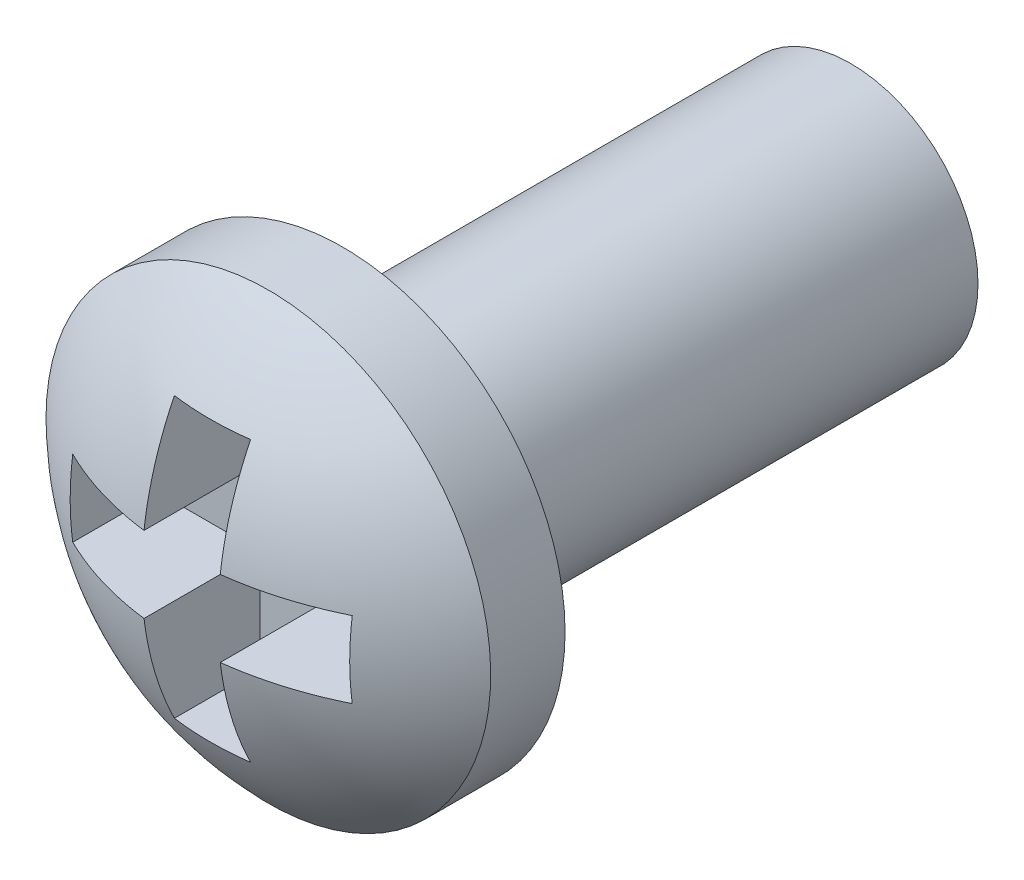
ISO-10303-21;
HEADER;
FILE_DESCRIPTION(('STEP AP214'),'2;1');
FILE_NAME('part.step','',(''),(''),'','','');
FILE_SCHEMA(('AUTOMOTIVE_DESIGN { 1 0 10303 214 1 1 1 1 }'));
ENDSEC;
DATA;
#1=APPLICATION_CONTEXT('core data for automotive mechanical design processes');
#2=APPLICATION_PROTOCOL_DEFINITION('international standard','automotive_design',2000,#1);
#3=PRODUCT_CONTEXT('',#1,'mechanical');
#4=PRODUCT('Part','Part','',(#3));
#5=PRODUCT_RELATED_PRODUCT_CATEGORY('part','',(#4));
#6=PRODUCT_DEFINITION_FORMATION('','',#4);
#7=PRODUCT_DEFINITION_CONTEXT('part definition',#1,'design');
#8=PRODUCT_DEFINITION('design','',#6,#7);
#9=PRODUCT_DEFINITION_SHAPE('','',#8);
#10=(LENGTH_UNIT() NAMED_UNIT(*) SI_UNIT(.MILLI.,.METRE.));
#11=(NAMED_UNIT(*) PLANE_ANGLE_UNIT() SI_UNIT($,.RADIAN.));
#12=(NAMED_UNIT(*) SI_UNIT($,.STERADIAN.) SOLID_ANGLE_UNIT());
#13=UNCERTAINTY_MEASURE_WITH_UNIT(LENGTH_MEASURE(1.E-05),#10,'distance_accuracy_value','');
#14=(GEOMETRIC_REPRESENTATION_CONTEXT(3) GLOBAL_UNCERTAINTY_ASSIGNED_CONTEXT((#13)) GLOBAL_UNIT_ASSIGNED_CONTEXT((#10,
#11,#12)) REPRESENTATION_CONTEXT('',''));
#15=CARTESIAN_POINT('',(0.,0.,0.));
#16=DIRECTION('',(0.,0.,1.));
#17=DIRECTION('',(1.,0.,0.));
#18=AXIS2_PLACEMENT_3D('',#15,#16,#17);
#19=CARTESIAN_POINT('',(0.,0.,-4.));
#20=DIRECTION('',(0.,0.,1.));
#21=DIRECTION('',(1.,0.,0.));
#22=AXIS2_PLACEMENT_3D('',#19,#20,#21);
#23=CYLINDRICAL_SURFACE('',#22,1.);
#24=CARTESIAN_POINT('',(0.,0.,-4.));
#25=DIRECTION('',(0.,0.,1.));
#26=DIRECTION('',(1.,0.,0.));
#27=AXIS2_PLACEMENT_3D('',#24,#25,#26);
#28=CIRCLE('',#27,1.);
#29=CARTESIAN_POINT('',(1.,0.,-4.));
#30=VERTEX_POINT('',#29);
#31=EDGE_CURVE('E212',#30,#30,#28,.T.);
#32=ORIENTED_EDGE('',*,*,#31,.T.);
#33=EDGE_LOOP('',(#32));
#34=FACE_BOUND('',#33,.T.);
#35=CARTESIAN_POINT('',(0.,0.,0.));
#36=DIRECTION('',(0.,0.,1.));
#37=DIRECTION('',(1.,0.,0.));
#38=AXIS2_PLACEMENT_3D('',#35,#36,#37);
#39=CIRCLE('',#38,1.);
#40=CARTESIAN_POINT('',(1.,0.,0.));
#41=VERTEX_POINT('',#40);
#42=EDGE_CURVE('E208',#41,#41,#39,.T.);
#43=ORIENTED_EDGE('',*,*,#42,.F.);
#44=EDGE_LOOP('',(#43));
#45=FACE_BOUND('',#44,.T.);
#46=ADVANCED_FACE('F41',(#34,#45),#23,.T.);
#47=CARTESIAN_POINT('',(0.,0.,-4.));
#48=DIRECTION('',(0.,0.,1.));
#49=DIRECTION('',(1.,0.,0.));
#50=AXIS2_PLACEMENT_3D('',#47,#48,#49);
#51=PLANE('',#50);
#52=ORIENTED_EDGE('',*,*,#31,.F.);
#53=EDGE_LOOP('',(#52));
#54=FACE_BOUND('',#53,.T.);
#55=ADVANCED_FACE('F281',(#54),#51,.F.);
#56=CARTESIAN_POINT('',(0.,0.,0.));
#57=DIRECTION('',(0.,0.,1.));
#58=DIRECTION('',(1.,0.,0.));
#59=AXIS2_PLACEMENT_3D('',#56,#57,#58);
#60=PLANE('',#59);
#61=ORIENTED_EDGE('',*,*,#42,.T.);
#62=EDGE_LOOP('',(#61));
#63=FACE_BOUND('',#62,.T.);
#64=CARTESIAN_POINT('',(0.,0.,0.));
#65=DIRECTION('',(0.,0.,-1.));
#66=DIRECTION('',(-1.,0.,0.));
#67=AXIS2_PLACEMENT_3D('',#64,#65,#66);
#68=CIRCLE('',#67,1.75);
#69=CARTESIAN_POINT('',(-1.75,0.,0.));
#70=VERTEX_POINT('',#69);
#71=EDGE_CURVE('E210',#70,#70,#68,.T.);
#72=ORIENTED_EDGE('',*,*,#71,.T.);
#73=EDGE_LOOP('',(#72));
#74=FACE_BOUND('',#73,.T.);
#75=ADVANCED_FACE('F286',(#63,#74),#60,.F.);
#76=CARTESIAN_POINT('',(0.,0.,-2.));
#77=DIRECTION('',(0.,0.,-1.));
#78=DIRECTION('',(-1.,0.,0.));
#79=AXIS2_PLACEMENT_3D('',#76,#77,#78);
#80=CYLINDRICAL_SURFACE('',#79,1.75);
#81=ORIENTED_EDGE('',*,*,#71,.F.);
#82=EDGE_LOOP('',(#81));
#83=FACE_BOUND('',#82,.T.);
#84=CARTESIAN_POINT('',(0.,0.,0.585357107135713));
#85=DIRECTION('',(0.,0.,-1.));
#86=DIRECTION('',(-1.,0.,0.));
#87=AXIS2_PLACEMENT_3D('',#84,#85,#86);
#88=CIRCLE('',#87,1.75);
#89=CARTESIAN_POINT('',(-1.75,0.,0.585357107135713));
#90=VERTEX_POINT('',#89);
#91=EDGE_CURVE('E180',#90,#90,#88,.T.);
#92=ORIENTED_EDGE('',*,*,#91,.T.);
#93=EDGE_LOOP('',(#92));
#94=FACE_BOUND('',#93,.T.);
#95=ADVANCED_FACE('F300',(#83,#94),#80,.T.);
#96=CARTESIAN_POINT('',(0.,0.,-1.2));
#97=DIRECTION('',(0.,0.,-1.));
#98=DIRECTION('',(1.,0.,0.));
#99=AXIS2_PLACEMENT_3D('',#96,#97,#98);
#100=SPHERICAL_SURFACE('',#99,2.5);
#101=CARTESIAN_POINT('',(0.,-1.1,-1.2));
#102=DIRECTION('',(0.,-1.,0.));
#103=DIRECTION('',(0.,0.,-1.));
#104=AXIS2_PLACEMENT_3D('',#101,#102,#103);
#105=CIRCLE('',#104,2.24499443206437);
#106=CARTESIAN_POINT('',(0.3,-1.1,1.0248595461287));
#107=VERTEX_POINT('',#106);
#108=CARTESIAN_POINT('',(-0.3,-1.1,1.0248595461287));
#109=VERTEX_POINT('',#108);
#110=EDGE_CURVE('E211',#107,#109,#105,.T.);
#111=ORIENTED_EDGE('',*,*,#110,.T.);
#112=CARTESIAN_POINT('',(-0.3,0.,-1.2));
#113=DIRECTION('',(-1.,0.,0.));
#114=DIRECTION('',(0.,0.,1.));
#115=AXIS2_PLACEMENT_3D('',#112,#113,#114);
#116=CIRCLE('',#115,2.48193472919818);
#117=CARTESIAN_POINT('',(-0.3,-0.3,1.26373699895098));
#118=VERTEX_POINT('',#117);
#119=EDGE_CURVE('E11',#109,#118,#116,.T.);
#120=ORIENTED_EDGE('',*,*,#119,.T.);
#121=CARTESIAN_POINT('',(0.,-0.3,-1.2));
#122=DIRECTION('',(0.,-1.,0.));
#123=DIRECTION('',(0.,0.,-1.));
#124=AXIS2_PLACEMENT_3D('',#121,#122,#123);
#125=CIRCLE('',#124,2.48193472919818);
#126=CARTESIAN_POINT('',(-1.1,-0.3,1.0248595461287));
#127=VERTEX_POINT('',#126);
#128=EDGE_CURVE('E48',#118,#127,#125,.T.);
#129=ORIENTED_EDGE('',*,*,#128,.T.);
#130=CARTESIAN_POINT('',(-1.1,0.,-1.2));
#131=DIRECTION('',(-1.,0.,0.));
#132=DIRECTION('',(0.,0.,1.));
#133=AXIS2_PLACEMENT_3D('',#130,#131,#132);
#134=CIRCLE('',#133,2.24499443206437);
#135=CARTESIAN_POINT('',(-1.1,0.3,1.0248595461287));
#136=VERTEX_POINT('',#135);
#137=EDGE_CURVE('E245',#127,#136,#134,.T.);
#138=ORIENTED_EDGE('',*,*,#137,.T.);
#139=CARTESIAN_POINT('',(0.,0.3,-1.2));
#140=DIRECTION('',(0.,1.,0.));
#141=DIRECTION('',(0.,0.,1.));
#142=AXIS2_PLACEMENT_3D('',#139,#140,#141);
#143=CIRCLE('',#142,2.48193472919818);
#144=CARTESIAN_POINT('',(-0.3,0.3,1.26373699895098));
#145=VERTEX_POINT('',#144);
#146=EDGE_CURVE('E236',#136,#145,#143,.T.);
#147=ORIENTED_EDGE('',*,*,#146,.T.);
#148=CARTESIAN_POINT('',(-0.3,0.,-1.2));
#149=DIRECTION('',(-1.,0.,0.));
#150=DIRECTION('',(0.,0.,1.));
#151=AXIS2_PLACEMENT_3D('',#148,#149,#150);
#152=CIRCLE('',#151,2.48193472919818);
#153=CARTESIAN_POINT('',(-0.3,1.1,1.0248595461287));
#154=VERTEX_POINT('',#153);
#155=EDGE_CURVE('E237',#145,#154,#152,.T.);
#156=ORIENTED_EDGE('',*,*,#155,.T.);
#157=CARTESIAN_POINT('',(0.,1.1,-1.2));
#158=DIRECTION('',(0.,1.,0.));
#159=DIRECTION('',(0.,0.,1.));
#160=AXIS2_PLACEMENT_3D('',#157,#158,#159);
#161=CIRCLE('',#160,2.24499443206437);
#162=CARTESIAN_POINT('',(0.3,1.1,1.0248595461287));
#163=VERTEX_POINT('',#162);
#164=EDGE_CURVE('E231',#154,#163,#161,.T.);
#165=ORIENTED_EDGE('',*,*,#164,.T.);
#166=CARTESIAN_POINT('',(0.3,0.,-1.2));
#167=DIRECTION('',(1.,0.,0.));
#168=DIRECTION('',(0.,0.,-1.));
#169=AXIS2_PLACEMENT_3D('',#166,#167,#168);
#170=CIRCLE('',#169,2.48193472919818);
#171=CARTESIAN_POINT('',(0.3,0.3,1.26373699895098));
#172=VERTEX_POINT('',#171);
#173=EDGE_CURVE('E229',#163,#172,#170,.T.);
#174=ORIENTED_EDGE('',*,*,#173,.T.);
#175=CARTESIAN_POINT('',(0.,0.3,-1.2));
#176=DIRECTION('',(0.,1.,0.));
#177=DIRECTION('',(0.,0.,1.));
#178=AXIS2_PLACEMENT_3D('',#175,#176,#177);
#179=CIRCLE('',#178,2.48193472919818);
#180=CARTESIAN_POINT('',(1.1,0.3,1.0248595461287));
#181=VERTEX_POINT('',#180);
#182=EDGE_CURVE('E230',#172,#181,#179,.T.);
#183=ORIENTED_EDGE('',*,*,#182,.T.);
#184=CARTESIAN_POINT('',(1.1,0.,-1.2));
#185=DIRECTION('',(1.,0.,0.));
#186=DIRECTION('',(0.,0.,-1.));
#187=AXIS2_PLACEMENT_3D('',#184,#185,#186);
#188=CIRCLE('',#187,2.24499443206437);
#189=CARTESIAN_POINT('',(1.1,-0.3,1.0248595461287));
#190=VERTEX_POINT('',#189);
#191=EDGE_CURVE('E224',#181,#190,#188,.T.);
#192=ORIENTED_EDGE('',*,*,#191,.T.);
#193=CARTESIAN_POINT('',(0.,-0.3,-1.2));
#194=DIRECTION('',(0.,-1.,0.));
#195=DIRECTION('',(0.,0.,-1.));
#196=AXIS2_PLACEMENT_3D('',#193,#194,#195);
#197=CIRCLE('',#196,2.48193472919818);
#198=CARTESIAN_POINT('',(0.3,-0.3,1.26373699895098));
#199=VERTEX_POINT('',#198);
#200=EDGE_CURVE('E222',#190,#199,#197,.T.);
#201=ORIENTED_EDGE('',*,*,#200,.T.);
#202=CARTESIAN_POINT('',(0.3,0.,-1.2));
#203=DIRECTION('',(1.,0.,0.));
#204=DIRECTION('',(0.,0.,-1.));
#205=AXIS2_PLACEMENT_3D('',#202,#203,#204);
#206=CIRCLE('',#205,2.48193472919818);
#207=EDGE_CURVE('E217',#199,#107,#206,.T.);
#208=ORIENTED_EDGE('',*,*,#207,.T.);
#209=EDGE_LOOP('',(#111,#120,#129,#138,#147,#156,#165,#174,#183,#192,#201,#208));
#210=FACE_BOUND('',#209,.T.);
#211=ORIENTED_EDGE('',*,*,#91,.F.);
#212=EDGE_LOOP('',(#211));
#213=FACE_BOUND('',#212,.T.);
#214=ADVANCED_FACE('F244',(#210,#213),#100,.T.);
#215=CARTESIAN_POINT('',(-0.3,-0.3,0.35));
#216=DIRECTION('',(-1.,0.,0.));
#217=DIRECTION('',(0.,0.,1.));
#218=AXIS2_PLACEMENT_3D('',#215,#216,#217);
#219=PLANE('',#218);
#220=DIRECTION('',(0.,0.,1.));
#221=VECTOR('',#220,1.);
#222=CARTESIAN_POINT('',(-0.3,-1.1,0.35));
#223=LINE('',#222,#221);
#224=CARTESIAN_POINT('',(-0.3,-1.1,0.35));
#225=VERTEX_POINT('',#224);
#226=EDGE_CURVE('E54',#225,#109,#223,.T.);
#227=ORIENTED_EDGE('',*,*,#226,.F.);
#228=DIRECTION('',(0.,-1.,0.));
#229=VECTOR('',#228,1.);
#230=CARTESIAN_POINT('',(-0.3,-0.3,0.35));
#231=LINE('',#230,#229);
#232=CARTESIAN_POINT('',(-0.3,-0.3,0.35));
#233=VERTEX_POINT('',#232);
#234=EDGE_CURVE('E129',#233,#225,#231,.T.);
#235=ORIENTED_EDGE('',*,*,#234,.F.);
#236=DIRECTION('',(0.,0.,1.));
#237=VECTOR('',#236,1.);
#238=CARTESIAN_POINT('',(-0.3,-0.3,0.35));
#239=LINE('',#238,#237);
#240=EDGE_CURVE('E171',#233,#118,#239,.T.);
#241=ORIENTED_EDGE('',*,*,#240,.T.);
#242=ORIENTED_EDGE('',*,*,#119,.F.);
#243=EDGE_LOOP('',(#227,#235,#241,#242));
#244=FACE_BOUND('',#243,.T.);
#245=ADVANCED_FACE('F127',(#244),#219,.F.);
#246=CARTESIAN_POINT('',(-1.1,-0.3,0.35));
#247=DIRECTION('',(0.,-1.,0.));
#248=DIRECTION('',(0.,0.,-1.));
#249=AXIS2_PLACEMENT_3D('',#246,#247,#248);
#250=PLANE('',#249);
#251=ORIENTED_EDGE('',*,*,#240,.F.);
#252=DIRECTION('',(1.,0.,0.));
#253=VECTOR('',#252,1.);
#254=CARTESIAN_POINT('',(-1.1,-0.3,0.35));
#255=LINE('',#254,#253);
#256=CARTESIAN_POINT('',(-1.1,-0.3,0.35));
#257=VERTEX_POINT('',#256);
#258=EDGE_CURVE('E131',#257,#233,#255,.T.);
#259=ORIENTED_EDGE('',*,*,#258,.F.);
#260=DIRECTION('',(0.,0.,1.));
#261=VECTOR('',#260,1.);
#262=CARTESIAN_POINT('',(-1.1,-0.3,0.35));
#263=LINE('',#262,#261);
#264=EDGE_CURVE('E177',#257,#127,#263,.T.);
#265=ORIENTED_EDGE('',*,*,#264,.T.);
#266=ORIENTED_EDGE('',*,*,#128,.F.);
#267=EDGE_LOOP('',(#251,#259,#265,#266));
#268=FACE_BOUND('',#267,.T.);
#269=ADVANCED_FACE('F273',(#268),#250,.F.);
#270=CARTESIAN_POINT('',(-1.1,0.3,0.35));
#271=DIRECTION('',(-1.,0.,0.));
#272=DIRECTION('',(0.,0.,1.));
#273=AXIS2_PLACEMENT_3D('',#270,#271,#272);
#274=PLANE('',#273);
#275=ORIENTED_EDGE('',*,*,#264,.F.);
#276=DIRECTION('',(0.,-1.,0.));
#277=VECTOR('',#276,1.);
#278=CARTESIAN_POINT('',(-1.1,0.3,0.35));
#279=LINE('',#278,#277);
#280=CARTESIAN_POINT('',(-1.1,0.3,0.35));
#281=VERTEX_POINT('',#280);
#282=EDGE_CURVE('E175',#281,#257,#279,.T.);
#283=ORIENTED_EDGE('',*,*,#282,.F.);
#284=DIRECTION('',(0.,0.,1.));
#285=VECTOR('',#284,1.);
#286=CARTESIAN_POINT('',(-1.1,0.3,0.35));
#287=LINE('',#286,#285);
#288=EDGE_CURVE('E179',#281,#136,#287,.T.);
#289=ORIENTED_EDGE('',*,*,#288,.T.);
#290=ORIENTED_EDGE('',*,*,#137,.F.);
#291=EDGE_LOOP('',(#275,#283,#289,#290));
#292=FACE_BOUND('',#291,.T.);
#293=ADVANCED_FACE('F275',(#292),#274,.F.);
#294=CARTESIAN_POINT('',(-0.3,0.3,0.35));
#295=DIRECTION('',(0.,1.,0.));
#296=DIRECTION('',(0.,0.,1.));
#297=AXIS2_PLACEMENT_3D('',#294,#295,#296);
#298=PLANE('',#297);
#299=ORIENTED_EDGE('',*,*,#288,.F.);
#300=DIRECTION('',(-1.,0.,0.));
#301=VECTOR('',#300,1.);
#302=CARTESIAN_POINT('',(-0.3,0.3,0.35));
#303=LINE('',#302,#301);
#304=CARTESIAN_POINT('',(-0.3,0.3,0.35));
#305=VERTEX_POINT('',#304);
#306=EDGE_CURVE('E168',#305,#281,#303,.T.);
#307=ORIENTED_EDGE('',*,*,#306,.F.);
#308=DIRECTION('',(0.,0.,1.));
#309=VECTOR('',#308,1.);
#310=CARTESIAN_POINT('',(-0.3,0.3,0.35));
#311=LINE('',#310,#309);
#312=EDGE_CURVE('E181',#305,#145,#311,.T.);
#313=ORIENTED_EDGE('',*,*,#312,.T.);
#314=ORIENTED_EDGE('',*,*,#146,.F.);
#315=EDGE_LOOP('',(#299,#307,#313,#314));
#316=FACE_BOUND('',#315,.T.);
#317=ADVANCED_FACE('F269',(#316),#298,.F.);
#318=CARTESIAN_POINT('',(-0.3,1.1,0.35));
#319=DIRECTION('',(-1.,0.,0.));
#320=DIRECTION('',(0.,0.,1.));
#321=AXIS2_PLACEMENT_3D('',#318,#319,#320);
#322=PLANE('',#321);
#323=ORIENTED_EDGE('',*,*,#312,.F.);
#324=DIRECTION('',(0.,-1.,0.));
#325=VECTOR('',#324,1.);
#326=CARTESIAN_POINT('',(-0.3,1.1,0.35));
#327=LINE('',#326,#325);
#328=CARTESIAN_POINT('',(-0.3,1.1,0.35));
#329=VERTEX_POINT('',#328);
#330=EDGE_CURVE('E166',#329,#305,#327,.T.);
#331=ORIENTED_EDGE('',*,*,#330,.F.);
#332=DIRECTION('',(0.,0.,1.));
#333=VECTOR('',#332,1.);
#334=CARTESIAN_POINT('',(-0.3,1.1,0.35));
#335=LINE('',#334,#333);
#336=EDGE_CURVE('E188',#329,#154,#335,.T.);
#337=ORIENTED_EDGE('',*,*,#336,.T.);
#338=ORIENTED_EDGE('',*,*,#155,.F.);
#339=EDGE_LOOP('',(#323,#331,#337,#338));
#340=FACE_BOUND('',#339,.T.);
#341=ADVANCED_FACE('F266',(#340),#322,.F.);
#342=CARTESIAN_POINT('',(0.3,1.1,0.35));
#343=DIRECTION('',(0.,1.,0.));
#344=DIRECTION('',(0.,0.,1.));
#345=AXIS2_PLACEMENT_3D('',#342,#343,#344);
#346=PLANE('',#345);
#347=ORIENTED_EDGE('',*,*,#336,.F.);
#348=DIRECTION('',(-1.,0.,0.));
#349=VECTOR('',#348,1.);
#350=CARTESIAN_POINT('',(0.3,1.1,0.35));
#351=LINE('',#350,#349);
#352=CARTESIAN_POINT('',(0.3,1.1,0.35));
#353=VERTEX_POINT('',#352);
#354=EDGE_CURVE('E164',#353,#329,#351,.T.);
#355=ORIENTED_EDGE('',*,*,#354,.F.);
#356=DIRECTION('',(0.,0.,1.));
#357=VECTOR('',#356,1.);
#358=CARTESIAN_POINT('',(0.3,1.1,0.35));
#359=LINE('',#358,#357);
#360=EDGE_CURVE('E189',#353,#163,#359,.T.);
#361=ORIENTED_EDGE('',*,*,#360,.T.);
#362=ORIENTED_EDGE('',*,*,#164,.F.);
#363=EDGE_LOOP('',(#347,#355,#361,#362));
#364=FACE_BOUND('',#363,.T.);
#365=ADVANCED_FACE('F261',(#364),#346,.F.);
#366=CARTESIAN_POINT('',(0.3,0.3,0.35));
#367=DIRECTION('',(1.,0.,0.));
#368=DIRECTION('',(0.,0.,-1.));
#369=AXIS2_PLACEMENT_3D('',#366,#367,#368);
#370=PLANE('',#369);
#371=ORIENTED_EDGE('',*,*,#360,.F.);
#372=DIRECTION('',(0.,1.,0.));
#373=VECTOR('',#372,1.);
#374=CARTESIAN_POINT('',(0.3,0.3,0.35));
#375=LINE('',#374,#373);
#376=CARTESIAN_POINT('',(0.3,0.3,0.35));
#377=VERTEX_POINT('',#376);
#378=EDGE_CURVE('E158',#377,#353,#375,.T.);
#379=ORIENTED_EDGE('',*,*,#378,.F.);
#380=DIRECTION('',(0.,0.,1.));
#381=VECTOR('',#380,1.);
#382=CARTESIAN_POINT('',(0.3,0.3,0.35));
#383=LINE('',#382,#381);
#384=EDGE_CURVE('E195',#377,#172,#383,.T.);
#385=ORIENTED_EDGE('',*,*,#384,.T.);
#386=ORIENTED_EDGE('',*,*,#173,.F.);
#387=EDGE_LOOP('',(#371,#379,#385,#386));
#388=FACE_BOUND('',#387,.T.);
#389=ADVANCED_FACE('F263',(#388),#370,.F.);
#390=CARTESIAN_POINT('',(1.1,0.3,0.35));
#391=DIRECTION('',(0.,1.,0.));
#392=DIRECTION('',(0.,0.,1.));
#393=AXIS2_PLACEMENT_3D('',#390,#391,#392);
#394=PLANE('',#393);
#395=ORIENTED_EDGE('',*,*,#384,.F.);
#396=DIRECTION('',(-1.,0.,0.));
#397=VECTOR('',#396,1.);
#398=CARTESIAN_POINT('',(1.1,0.3,0.35));
#399=LINE('',#398,#397);
#400=CARTESIAN_POINT('',(1.1,0.3,0.35));
#401=VERTEX_POINT('',#400);
#402=EDGE_CURVE('E160',#401,#377,#399,.T.);
#403=ORIENTED_EDGE('',*,*,#402,.F.);
#404=DIRECTION('',(0.,0.,1.));
#405=VECTOR('',#404,1.);
#406=CARTESIAN_POINT('',(1.1,0.3,0.35));
#407=LINE('',#406,#405);
#408=EDGE_CURVE('E194',#401,#181,#407,.T.);
#409=ORIENTED_EDGE('',*,*,#408,.T.);
#410=ORIENTED_EDGE('',*,*,#182,.F.);
#411=EDGE_LOOP('',(#395,#403,#409,#410));
#412=FACE_BOUND('',#411,.T.);
#413=ADVANCED_FACE('F257',(#412),#394,.F.);
#414=CARTESIAN_POINT('',(1.1,-0.3,0.35));
#415=DIRECTION('',(1.,0.,0.));
#416=DIRECTION('',(0.,0.,-1.));
#417=AXIS2_PLACEMENT_3D('',#414,#415,#416);
#418=PLANE('',#417);
#419=ORIENTED_EDGE('',*,*,#408,.F.);
#420=DIRECTION('',(0.,1.,0.));
#421=VECTOR('',#420,1.);
#422=CARTESIAN_POINT('',(1.1,-0.3,0.35));
#423=LINE('',#422,#421);
#424=CARTESIAN_POINT('',(1.1,-0.3,0.35));
#425=VERTEX_POINT('',#424);
#426=EDGE_CURVE('E153',#425,#401,#423,.T.);
#427=ORIENTED_EDGE('',*,*,#426,.F.);
#428=DIRECTION('',(0.,0.,1.));
#429=VECTOR('',#428,1.);
#430=CARTESIAN_POINT('',(1.1,-0.3,0.35));
#431=LINE('',#430,#429);
#432=EDGE_CURVE('E198',#425,#190,#431,.T.);
#433=ORIENTED_EDGE('',*,*,#432,.T.);
#434=ORIENTED_EDGE('',*,*,#191,.F.);
#435=EDGE_LOOP('',(#419,#427,#433,#434));
#436=FACE_BOUND('',#435,.T.);
#437=ADVANCED_FACE('F253',(#436),#418,.F.);
#438=CARTESIAN_POINT('',(0.3,-0.3,0.35));
#439=DIRECTION('',(0.,-1.,0.));
#440=DIRECTION('',(0.,0.,-1.));
#441=AXIS2_PLACEMENT_3D('',#438,#439,#440);
#442=PLANE('',#441);
#443=ORIENTED_EDGE('',*,*,#432,.F.);
#444=DIRECTION('',(1.,0.,0.));
#445=VECTOR('',#444,1.);
#446=CARTESIAN_POINT('',(0.3,-0.3,0.35));
#447=LINE('',#446,#445);
#448=CARTESIAN_POINT('',(0.3,-0.3,0.35));
#449=VERTEX_POINT('',#448);
#450=EDGE_CURVE('E151',#449,#425,#447,.T.);
#451=ORIENTED_EDGE('',*,*,#450,.F.);
#452=DIRECTION('',(0.,0.,1.));
#453=VECTOR('',#452,1.);
#454=CARTESIAN_POINT('',(0.3,-0.3,0.35));
#455=LINE('',#454,#453);
#456=EDGE_CURVE('E201',#449,#199,#455,.T.);
#457=ORIENTED_EDGE('',*,*,#456,.T.);
#458=ORIENTED_EDGE('',*,*,#200,.F.);
#459=EDGE_LOOP('',(#443,#451,#457,#458));
#460=FACE_BOUND('',#459,.T.);
#461=ADVANCED_FACE('F255',(#460),#442,.F.);
#462=CARTESIAN_POINT('',(0.3,-1.1,0.35));
#463=DIRECTION('',(1.,0.,0.));
#464=DIRECTION('',(0.,0.,-1.));
#465=AXIS2_PLACEMENT_3D('',#462,#463,#464);
#466=PLANE('',#465);
#467=ORIENTED_EDGE('',*,*,#456,.F.);
#468=DIRECTION('',(0.,1.,0.));
#469=VECTOR('',#468,1.);
#470=CARTESIAN_POINT('',(0.3,-1.1,0.35));
#471=LINE('',#470,#469);
#472=CARTESIAN_POINT('',(0.3,-1.1,0.35));
#473=VERTEX_POINT('',#472);
#474=EDGE_CURVE('E142',#473,#449,#471,.T.);
#475=ORIENTED_EDGE('',*,*,#474,.F.);
#476=DIRECTION('',(0.,0.,1.));
#477=VECTOR('',#476,1.);
#478=CARTESIAN_POINT('',(0.3,-1.1,0.35));
#479=LINE('',#478,#477);
#480=EDGE_CURVE('E134',#473,#107,#479,.T.);
#481=ORIENTED_EDGE('',*,*,#480,.T.);
#482=ORIENTED_EDGE('',*,*,#207,.F.);
#483=EDGE_LOOP('',(#467,#475,#481,#482));
#484=FACE_BOUND('',#483,.T.);
#485=ADVANCED_FACE('F248',(#484),#466,.F.);
#486=CARTESIAN_POINT('',(-0.3,-1.1,0.35));
#487=DIRECTION('',(0.,-1.,0.));
#488=DIRECTION('',(0.,0.,-1.));
#489=AXIS2_PLACEMENT_3D('',#486,#487,#488);
#490=PLANE('',#489);
#491=ORIENTED_EDGE('',*,*,#480,.F.);
#492=DIRECTION('',(1.,0.,0.));
#493=VECTOR('',#492,1.);
#494=CARTESIAN_POINT('',(-0.3,-1.1,0.35));
#495=LINE('',#494,#493);
#496=EDGE_CURVE('E140',#225,#473,#495,.T.);
#497=ORIENTED_EDGE('',*,*,#496,.F.);
#498=ORIENTED_EDGE('',*,*,#226,.T.);
#499=ORIENTED_EDGE('',*,*,#110,.F.);
#500=EDGE_LOOP('',(#491,#497,#498,#499));
#501=FACE_BOUND('',#500,.T.);
#502=ADVANCED_FACE('F139',(#501),#490,.F.);
#503=CARTESIAN_POINT('',(0.,0.,0.35));
#504=DIRECTION('',(0.,0.,1.));
#505=DIRECTION('',(1.,0.,0.));
#506=AXIS2_PLACEMENT_3D('',#503,#504,#505);
#507=PLANE('',#506);
#508=ORIENTED_EDGE('',*,*,#234,.T.);
#509=ORIENTED_EDGE('',*,*,#496,.T.);
#510=ORIENTED_EDGE('',*,*,#474,.T.);
#511=ORIENTED_EDGE('',*,*,#450,.T.);
#512=ORIENTED_EDGE('',*,*,#426,.T.);
#513=ORIENTED_EDGE('',*,*,#402,.T.);
#514=ORIENTED_EDGE('',*,*,#378,.T.);
#515=ORIENTED_EDGE('',*,*,#354,.T.);
#516=ORIENTED_EDGE('',*,*,#330,.T.);
#517=ORIENTED_EDGE('',*,*,#306,.T.);
#518=ORIENTED_EDGE('',*,*,#282,.T.);
#519=ORIENTED_EDGE('',*,*,#258,.T.);
#520=EDGE_LOOP('',(#508,#509,#510,#511,#512,#513,#514,#515,#516,#517,#518,#519));
#521=FACE_BOUND('',#520,.T.);
#522=ADVANCED_FACE('F144',(#521),#507,.T.);
#523=CLOSED_SHELL('',(#46,#55,#75,#95,#214,#245,#269,#293,#317,#341,#365,#389,#413,#437,#461,
#485,#502,#522));
#524=MANIFOLD_SOLID_BREP('B2',#523);
#525=ADVANCED_BREP_SHAPE_REPRESENTATION('',(#18,#524),#14);
#526=SHAPE_DEFINITION_REPRESENTATION(#9,#525);
ENDSEC;
END-ISO-10303-21;
